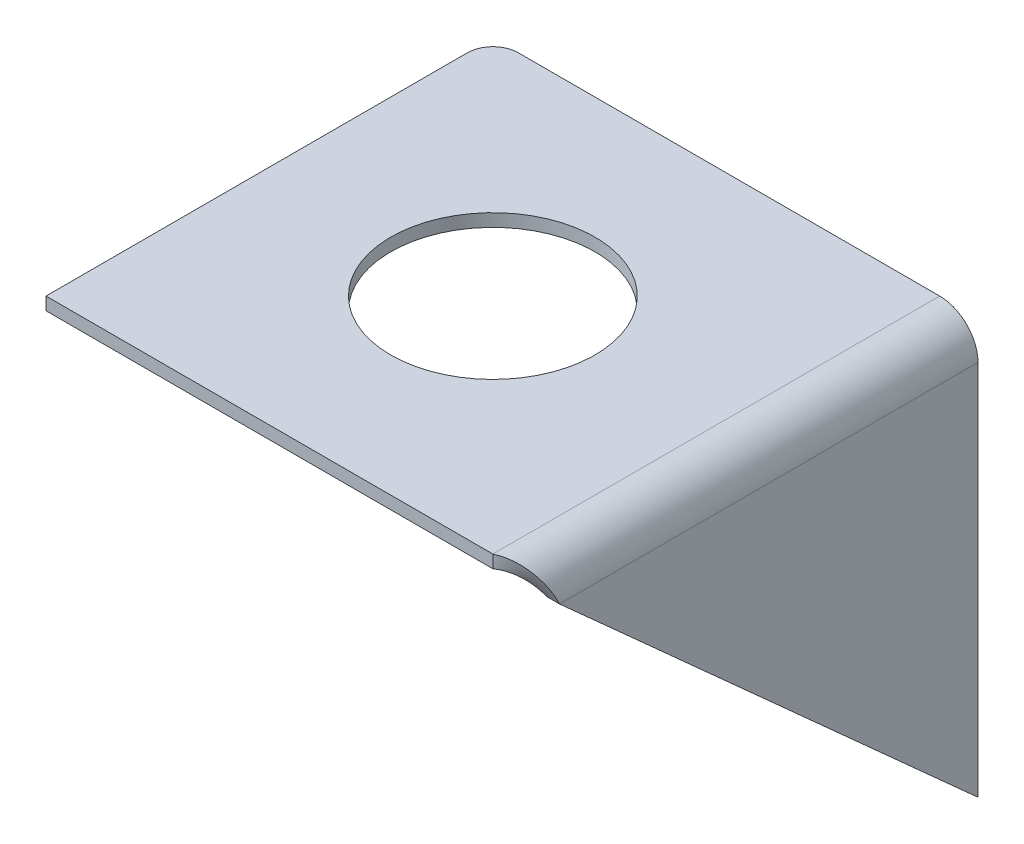
ISO-10303-21;
HEADER;
FILE_DESCRIPTION(('STEP AP214'),'2;1');
FILE_NAME('part.step','',(''),(''),'','','');
FILE_SCHEMA(('AUTOMOTIVE_DESIGN { 1 0 10303 214 1 1 1 1 }'));
ENDSEC;
DATA;
#1=APPLICATION_CONTEXT('core data for automotive mechanical design processes');
#2=APPLICATION_PROTOCOL_DEFINITION('international standard','automotive_design',2000,#1);
#3=PRODUCT_CONTEXT('',#1,'mechanical');
#4=PRODUCT('Part','Part','',(#3));
#5=PRODUCT_RELATED_PRODUCT_CATEGORY('part','',(#4));
#6=PRODUCT_DEFINITION_FORMATION('','',#4);
#7=PRODUCT_DEFINITION_CONTEXT('part definition',#1,'design');
#8=PRODUCT_DEFINITION('design','',#6,#7);
#9=PRODUCT_DEFINITION_SHAPE('','',#8);
#10=(LENGTH_UNIT() NAMED_UNIT(*) SI_UNIT(.MILLI.,.METRE.));
#11=(NAMED_UNIT(*) PLANE_ANGLE_UNIT() SI_UNIT($,.RADIAN.));
#12=(NAMED_UNIT(*) SI_UNIT($,.STERADIAN.) SOLID_ANGLE_UNIT());
#13=UNCERTAINTY_MEASURE_WITH_UNIT(LENGTH_MEASURE(1.E-05),#10,'distance_accuracy_value','');
#14=(GEOMETRIC_REPRESENTATION_CONTEXT(3) GLOBAL_UNCERTAINTY_ASSIGNED_CONTEXT((#13)) GLOBAL_UNIT_ASSIGNED_CONTEXT((#10,
#11,#12)) REPRESENTATION_CONTEXT('',''));
#15=CARTESIAN_POINT('',(0.,0.,0.));
#16=DIRECTION('',(0.,0.,1.));
#17=DIRECTION('',(1.,0.,0.));
#18=AXIS2_PLACEMENT_3D('',#15,#16,#17);
#19=CARTESIAN_POINT('',(-31.,2.,-31.));
#20=DIRECTION('',(0.,1.,0.));
#21=DIRECTION('',(0.,0.,1.));
#22=AXIS2_PLACEMENT_3D('',#19,#20,#21);
#23=CYLINDRICAL_SURFACE('',#22,4.);
#24=DIRECTION('',(0.,1.,0.));
#25=VECTOR('',#24,1.);
#26=CARTESIAN_POINT('',(-31.,2.,-35.));
#27=LINE('',#26,#25);
#28=CARTESIAN_POINT('',(-31.,0.,-35.));
#29=VERTEX_POINT('',#28);
#30=CARTESIAN_POINT('',(-31.,2.,-35.));
#31=VERTEX_POINT('',#30);
#32=EDGE_CURVE('E13',#29,#31,#27,.T.);
#33=ORIENTED_EDGE('',*,*,#32,.F.);
#34=CARTESIAN_POINT('',(-31.,0.,-31.));
#35=DIRECTION('',(0.,1.,0.));
#36=DIRECTION('',(0.,0.,1.));
#37=AXIS2_PLACEMENT_3D('',#34,#35,#36);
#38=CIRCLE('',#37,4.);
#39=CARTESIAN_POINT('',(-35.,0.,-31.));
#40=VERTEX_POINT('',#39);
#41=EDGE_CURVE('E148',#29,#40,#38,.T.);
#42=ORIENTED_EDGE('',*,*,#41,.T.);
#43=DIRECTION('',(0.,1.,0.));
#44=VECTOR('',#43,1.);
#45=CARTESIAN_POINT('',(-35.,2.,-31.));
#46=LINE('',#45,#44);
#47=CARTESIAN_POINT('',(-35.,2.,-31.));
#48=VERTEX_POINT('',#47);
#49=EDGE_CURVE('E64',#40,#48,#46,.T.);
#50=ORIENTED_EDGE('',*,*,#49,.T.);
#51=CARTESIAN_POINT('',(-31.,2.,-31.));
#52=DIRECTION('',(0.,1.,0.));
#53=DIRECTION('',(0.,0.,1.));
#54=AXIS2_PLACEMENT_3D('',#51,#52,#53);
#55=CIRCLE('',#54,4.);
#56=EDGE_CURVE('E125',#31,#48,#55,.T.);
#57=ORIENTED_EDGE('',*,*,#56,.F.);
#58=EDGE_LOOP('',(#33,#42,#50,#57));
#59=FACE_BOUND('',#58,.T.);
#60=ADVANCED_FACE('F54',(#59),#23,.T.);
#61=CARTESIAN_POINT('',(-35.,2.,-31.));
#62=DIRECTION('',(-1.,0.,0.));
#63=DIRECTION('',(0.,0.,1.));
#64=AXIS2_PLACEMENT_3D('',#61,#62,#63);
#65=PLANE('',#64);
#66=ORIENTED_EDGE('',*,*,#49,.F.);
#67=DIRECTION('',(0.,0.,1.));
#68=VECTOR('',#67,1.);
#69=CARTESIAN_POINT('',(-35.,0.,-31.));
#70=LINE('',#69,#68);
#71=CARTESIAN_POINT('',(-35.,0.,35.));
#72=VERTEX_POINT('',#71);
#73=EDGE_CURVE('E146',#40,#72,#70,.T.);
#74=ORIENTED_EDGE('',*,*,#73,.T.);
#75=DIRECTION('',(0.,1.,0.));
#76=VECTOR('',#75,1.);
#77=CARTESIAN_POINT('',(-35.,2.,35.));
#78=LINE('',#77,#76);
#79=CARTESIAN_POINT('',(-35.,2.,35.));
#80=VERTEX_POINT('',#79);
#81=EDGE_CURVE('E72',#72,#80,#78,.T.);
#82=ORIENTED_EDGE('',*,*,#81,.T.);
#83=DIRECTION('',(0.,0.,1.));
#84=VECTOR('',#83,1.);
#85=CARTESIAN_POINT('',(-35.,2.,-31.));
#86=LINE('',#85,#84);
#87=EDGE_CURVE('E128',#48,#80,#86,.T.);
#88=ORIENTED_EDGE('',*,*,#87,.F.);
#89=EDGE_LOOP('',(#66,#74,#82,#88));
#90=FACE_BOUND('',#89,.T.);
#91=ADVANCED_FACE('F173',(#90),#65,.T.);
#92=CARTESIAN_POINT('',(-35.,2.,35.));
#93=DIRECTION('',(0.,0.,1.));
#94=DIRECTION('',(1.,0.,0.));
#95=AXIS2_PLACEMENT_3D('',#92,#93,#94);
#96=PLANE('',#95);
#97=ORIENTED_EDGE('',*,*,#81,.F.);
#98=DIRECTION('',(1.,0.,0.));
#99=VECTOR('',#98,1.);
#100=CARTESIAN_POINT('',(-31.,0.,35.));
#101=LINE('',#100,#99);
#102=CARTESIAN_POINT('',(35.,0.,35.));
#103=VERTEX_POINT('',#102);
#104=EDGE_CURVE('E142',#72,#103,#101,.T.);
#105=ORIENTED_EDGE('',*,*,#104,.T.);
#106=DIRECTION('',(0.,1.,0.));
#107=VECTOR('',#106,1.);
#108=CARTESIAN_POINT('',(35.,2.,35.));
#109=LINE('',#108,#107);
#110=CARTESIAN_POINT('',(35.,2.,35.));
#111=VERTEX_POINT('',#110);
#112=EDGE_CURVE('E153',#103,#111,#109,.T.);
#113=ORIENTED_EDGE('',*,*,#112,.T.);
#114=DIRECTION('',(1.,0.,0.));
#115=VECTOR('',#114,1.);
#116=CARTESIAN_POINT('',(-35.,2.,35.));
#117=LINE('',#116,#115);
#118=EDGE_CURVE('E130',#80,#111,#117,.T.);
#119=ORIENTED_EDGE('',*,*,#118,.F.);
#120=EDGE_LOOP('',(#97,#105,#113,#119));
#121=FACE_BOUND('',#120,.T.);
#122=ADVANCED_FACE('F175',(#121),#96,.T.);
#123=CARTESIAN_POINT('',(-31.,2.,-35.));
#124=DIRECTION('',(0.,0.,-1.));
#125=DIRECTION('',(-1.,0.,0.));
#126=AXIS2_PLACEMENT_3D('',#123,#124,#125);
#127=PLANE('',#126);
#128=DIRECTION('',(1.,0.,0.));
#129=VECTOR('',#128,1.);
#130=CARTESIAN_POINT('',(-31.,0.,-35.));
#131=LINE('',#130,#129);
#132=CARTESIAN_POINT('',(35.,0.,-35.));
#133=VERTEX_POINT('',#132);
#134=EDGE_CURVE('E120',#133,#29,#131,.F.);
#135=ORIENTED_EDGE('',*,*,#134,.T.);
#136=ORIENTED_EDGE('',*,*,#32,.T.);
#137=DIRECTION('',(-1.,0.,0.));
#138=VECTOR('',#137,1.);
#139=CARTESIAN_POINT('',(-31.,2.,-35.));
#140=LINE('',#139,#138);
#141=CARTESIAN_POINT('',(35.,2.,-35.));
#142=VERTEX_POINT('',#141);
#143=EDGE_CURVE('E118',#142,#31,#140,.T.);
#144=ORIENTED_EDGE('',*,*,#143,.F.);
#145=DIRECTION('',(0.,1.,0.));
#146=VECTOR('',#145,1.);
#147=CARTESIAN_POINT('',(35.,2.,-35.));
#148=LINE('',#147,#146);
#149=EDGE_CURVE('E58',#133,#142,#148,.T.);
#150=ORIENTED_EDGE('',*,*,#149,.F.);
#151=EDGE_LOOP('',(#135,#136,#144,#150));
#152=FACE_BOUND('',#151,.T.);
#153=ADVANCED_FACE('F116',(#152),#127,.T.);
#154=CARTESIAN_POINT('',(0.,2.,0.));
#155=DIRECTION('',(0.,1.,0.));
#156=DIRECTION('',(0.,0.,1.));
#157=AXIS2_PLACEMENT_3D('',#154,#155,#156);
#158=CYLINDRICAL_SURFACE('',#157,16.);
#159=CARTESIAN_POINT('',(0.,2.,0.));
#160=DIRECTION('',(0.,1.,0.));
#161=DIRECTION('',(0.,0.,1.));
#162=AXIS2_PLACEMENT_3D('',#159,#160,#161);
#163=CIRCLE('',#162,16.);
#164=CARTESIAN_POINT('',(0.,2.,16.));
#165=VERTEX_POINT('',#164);
#166=EDGE_CURVE('E135',#165,#165,#163,.T.);
#167=ORIENTED_EDGE('',*,*,#166,.T.);
#168=EDGE_LOOP('',(#167));
#169=FACE_BOUND('',#168,.T.);
#170=CARTESIAN_POINT('',(0.,0.,0.));
#171=DIRECTION('',(0.,1.,0.));
#172=DIRECTION('',(0.,0.,1.));
#173=AXIS2_PLACEMENT_3D('',#170,#171,#172);
#174=CIRCLE('',#173,16.);
#175=CARTESIAN_POINT('',(0.,0.,16.));
#176=VERTEX_POINT('',#175);
#177=EDGE_CURVE('E145',#176,#176,#174,.T.);
#178=ORIENTED_EDGE('',*,*,#177,.F.);
#179=EDGE_LOOP('',(#178));
#180=FACE_BOUND('',#179,.T.);
#181=ADVANCED_FACE('F56',(#169,#180),#158,.F.);
#182=CARTESIAN_POINT('',(-31.,2.,-31.));
#183=DIRECTION('',(0.,1.,0.));
#184=DIRECTION('',(0.,0.,1.));
#185=AXIS2_PLACEMENT_3D('',#182,#183,#184);
#186=PLANE('',#185);
#187=DIRECTION('',(0.,0.,-1.));
#188=VECTOR('',#187,1.);
#189=CARTESIAN_POINT('',(35.,2.,-35.));
#190=LINE('',#189,#188);
#191=EDGE_CURVE('E97',#111,#142,#190,.T.);
#192=ORIENTED_EDGE('',*,*,#191,.T.);
#193=ORIENTED_EDGE('',*,*,#143,.T.);
#194=ORIENTED_EDGE('',*,*,#56,.T.);
#195=ORIENTED_EDGE('',*,*,#87,.T.);
#196=ORIENTED_EDGE('',*,*,#118,.T.);
#197=EDGE_LOOP('',(#192,#193,#194,#195,#196));
#198=FACE_BOUND('',#197,.T.);
#199=ORIENTED_EDGE('',*,*,#166,.F.);
#200=EDGE_LOOP('',(#199));
#201=FACE_BOUND('',#200,.T.);
#202=ADVANCED_FACE('F123',(#198,#201),#186,.T.);
#203=CARTESIAN_POINT('',(-31.,0.,-31.));
#204=DIRECTION('',(0.,1.,0.));
#205=DIRECTION('',(0.,0.,1.));
#206=AXIS2_PLACEMENT_3D('',#203,#204,#205);
#207=PLANE('',#206);
#208=DIRECTION('',(0.,0.,1.));
#209=VECTOR('',#208,1.);
#210=CARTESIAN_POINT('',(35.,0.,-31.));
#211=LINE('',#210,#209);
#212=EDGE_CURVE('E138',#103,#133,#211,.F.);
#213=ORIENTED_EDGE('',*,*,#212,.F.);
#214=ORIENTED_EDGE('',*,*,#104,.F.);
#215=ORIENTED_EDGE('',*,*,#73,.F.);
#216=ORIENTED_EDGE('',*,*,#41,.F.);
#217=ORIENTED_EDGE('',*,*,#134,.F.);
#218=EDGE_LOOP('',(#213,#214,#215,#216,#217));
#219=FACE_BOUND('',#218,.T.);
#220=ORIENTED_EDGE('',*,*,#177,.T.);
#221=EDGE_LOOP('',(#220));
#222=FACE_BOUND('',#221,.T.);
#223=ADVANCED_FACE('F170',(#219,#222),#207,.F.);
#224=CARTESIAN_POINT('',(35.,-4.,-35.));
#225=DIRECTION('',(0.,0.,-1.));
#226=DIRECTION('',(-1.,0.,0.));
#227=AXIS2_PLACEMENT_3D('',#224,#225,#226);
#228=PLANE('',#227);
#229=DIRECTION('',(1.,0.,0.));
#230=VECTOR('',#229,1.);
#231=CARTESIAN_POINT('',(41.,-3.99999999999998,-35.));
#232=LINE('',#231,#230);
#233=CARTESIAN_POINT('',(39.,-3.99999999999999,-35.));
#234=VERTEX_POINT('',#233);
#235=CARTESIAN_POINT('',(41.,-3.99999999999998,-35.));
#236=VERTEX_POINT('',#235);
#237=EDGE_CURVE('E286',#234,#236,#232,.T.);
#238=ORIENTED_EDGE('',*,*,#237,.F.);
#239=CARTESIAN_POINT('',(35.,-4.,-35.));
#240=DIRECTION('',(0.,0.,1.));
#241=DIRECTION('',(1.,0.,0.));
#242=AXIS2_PLACEMENT_3D('',#239,#240,#241);
#243=CIRCLE('',#242,4.);
#244=EDGE_CURVE('E167',#133,#234,#243,.F.);
#245=ORIENTED_EDGE('',*,*,#244,.F.);
#246=ORIENTED_EDGE('',*,*,#149,.T.);
#247=CARTESIAN_POINT('',(35.,-4.,-35.));
#248=DIRECTION('',(0.,0.,1.));
#249=DIRECTION('',(1.,0.,0.));
#250=AXIS2_PLACEMENT_3D('',#247,#248,#249);
#251=CIRCLE('',#250,6.);
#252=EDGE_CURVE('E141',#142,#236,#251,.F.);
#253=ORIENTED_EDGE('',*,*,#252,.T.);
#254=EDGE_LOOP('',(#238,#245,#246,#253));
#255=FACE_BOUND('',#254,.T.);
#256=ADVANCED_FACE('F164',(#255),#228,.T.);
#257=CARTESIAN_POINT('',(41.02,-3.99999999999998,30.5555555555556));
#258=CARTESIAN_POINT('',(41.02,-3.21186746954249,30.9259806556928));
#259=CARTESIAN_POINT('',(40.8633155135432,-2.42427773615711,31.2962962962963));
#260=CARTESIAN_POINT('',(40.2601940578926,-0.968213738167171,32.037037037037));
#261=CARTESIAN_POINT('',(39.813994391237,-0.300428745751001,32.4074074074074));
#262=CARTESIAN_POINT('',(38.699571254249,0.813994391237052,33.1481481481482));
#263=CARTESIAN_POINT('',(38.0317862618328,1.26019405789264,33.5185185185185));
#264=CARTESIAN_POINT('',(36.5757222638429,1.86331551354326,34.2592592592593));
#265=CARTESIAN_POINT('',(35.7881325304575,2.02,34.6295748998627));
#266=CARTESIAN_POINT('',(35.,2.02,35.));
#267=CARTESIAN_POINT('',(41.,-3.99999999999998,30.5555555555556));
#268=CARTESIAN_POINT('',(41.,-3.21448599265122,30.9259805544814));
#269=CARTESIAN_POINT('',(40.8438360600099,-2.4295126938443,31.2962962962963));
#270=CARTESIAN_POINT('',(40.2427183301255,-0.978286117774589,32.037037037037));
#271=CARTESIAN_POINT('',(39.7980010543891,-0.312719680150499,32.4074074074074));
#272=CARTESIAN_POINT('',(38.6872803198495,0.798001054389089,33.1481481481482));
#273=CARTESIAN_POINT('',(38.0217138822254,1.24271833012555,33.5185185185185));
#274=CARTESIAN_POINT('',(36.5704873061557,1.8438360600099,34.2592592592593));
#275=CARTESIAN_POINT('',(35.7855140073488,2.,34.6295750010741));
#276=CARTESIAN_POINT('',(35.,2.,35.));
#277=CARTESIAN_POINT('',(39.,-3.99999999999999,30.5555555555556));
#278=CARTESIAN_POINT('',(39.,-3.47633830352483,30.9259704333418));
#279=CARTESIAN_POINT('',(38.8958907066732,-2.95300846256287,31.2962962962963));
#280=CARTESIAN_POINT('',(38.495145553417,-1.98552407851639,32.037037037037));
#281=CARTESIAN_POINT('',(38.1986673695927,-1.54181312010033,32.4074074074074));
#282=CARTESIAN_POINT('',(37.4581868798996,-0.801332630407274,33.1481481481482));
#283=CARTESIAN_POINT('',(37.0144759214836,-0.504854446582964,33.5185185185185));
#284=CARTESIAN_POINT('',(36.0469915374371,-0.104109293326735,34.2592592592593));
#285=CARTESIAN_POINT('',(35.5236616964751,0.,34.6295851222137));
#286=CARTESIAN_POINT('',(35.,0.,35.));
#287=CARTESIAN_POINT('',(38.9798,-3.99999999999999,30.5555555555556));
#288=CARTESIAN_POINT('',(38.9798,-3.47898301186465,30.9259703311183));
#289=CARTESIAN_POINT('',(38.8762164586045,-2.95829576982692,31.2962962962963));
#290=CARTESIAN_POINT('',(38.4774950683723,-1.99569718191989,32.037037037037));
#291=CARTESIAN_POINT('',(38.1825140993763,-1.55422696384383,32.4074074074074));
#292=CARTESIAN_POINT('',(37.4457730361561,-0.817485900623717,33.1481481481482));
#293=CARTESIAN_POINT('',(37.0043028180801,-0.52250493162772,33.5185185185185));
#294=CARTESIAN_POINT('',(36.0417042301731,-0.123783541395435,34.2592592592593));
#295=CARTESIAN_POINT('',(35.5210169881353,-0.0201999999999974,34.6295852244372));
#296=CARTESIAN_POINT('',(35.,-0.0201999999999974,35.));
#297=B_SPLINE_SURFACE_WITH_KNOTS('',1,3,((#257,#258,#259,#260,#261,#262,#263,#264,#265,#266),
(#267,#268,#269,#270,#271,#272,#273,#274,#275,#276),(#277,#278,#279,#280,#281,#282,#283,#284,
#285,#286),(#287,#288,#289,#290,#291,#292,#293,#294,#295,#296)),.UNSPECIFIED.,.F.,.F.,.F.,(2,1,
1,2),(4,2,2,2,4),(-0.01,0.,1.,1.0101),(0.,0.25,0.5,0.75,1.),.UNSPECIFIED.);
#298=CARTESIAN_POINT('',(39.,-3.99999999999999,30.5555555555556));
#299=CARTESIAN_POINT('',(39.0000274755203,-3.86214342866317,30.6530750615278));
#300=CARTESIAN_POINT('',(38.992874570986,-3.7242886595545,30.7505903154907));
#301=CARTESIAN_POINT('',(38.9644046985006,-3.45005606338389,30.9456100857196));
#302=CARTESIAN_POINT('',(38.9430887430913,-3.31367813144852,31.0431146022548));
#303=CARTESIAN_POINT('',(38.8865115317745,-3.04395786422073,31.2380483972806));
#304=CARTESIAN_POINT('',(38.8512611881907,-2.91061323968872,31.3354776750138));
#305=CARTESIAN_POINT('',(38.7672013863381,-2.64827471850216,31.5303385760535));
#306=CARTESIAN_POINT('',(38.7183921698177,-2.51928074432351,31.6277701992873));
#307=CARTESIAN_POINT('',(38.6076288668506,-2.26677839733377,31.822815713552));
#308=CARTESIAN_POINT('',(38.5456504399602,-2.14328070155194,31.9204296056927));
#309=CARTESIAN_POINT('',(38.4092622295631,-1.90334229146896,32.1156520659513));
#310=CARTESIAN_POINT('',(38.3348521768579,-1.78690173005969,32.2132606339081));
#311=CARTESIAN_POINT('',(38.1744367339214,-1.56238242408134,32.408440660869));
#312=CARTESIAN_POINT('',(38.0884363386499,-1.45430010885772,32.5060121178012));
#313=CARTESIAN_POINT('',(37.9057364703864,-1.24759718022382,32.7011555333412));
#314=CARTESIAN_POINT('',(37.8090371753532,-1.14897640948694,32.7987274919136));
#315=CARTESIAN_POINT('',(37.6059540833299,-0.962231722133097,32.9938872123958));
#316=CARTESIAN_POINT('',(37.4995686521825,-0.874109582561006,33.0914749741893));
#317=CARTESIAN_POINT('',(37.2782631000105,-0.709324065577846,33.2866417281228));
#318=CARTESIAN_POINT('',(37.1633431867625,-0.632660409340482,33.3842207204185));
#319=CARTESIAN_POINT('',(36.9261784439221,-0.491598697180235,33.5794070087195));
#320=CARTESIAN_POINT('',(36.8039319079595,-0.427203513291564,33.6770143060082));
#321=CARTESIAN_POINT('',(36.5534515294017,-0.311393285111272,33.8722202754528));
#322=CARTESIAN_POINT('',(36.425218567054,-0.259976339570977,33.9698189467758));
#323=CARTESIAN_POINT('',(36.1906727335881,-0.179739598261492,34.1451694575992));
#324=CARTESIAN_POINT('',(36.0851989834272,-0.148451163569438,34.2229252762404));
#325=CARTESIAN_POINT('',(35.8720410439309,-0.0946672802941426,34.3784250120138));
#326=CARTESIAN_POINT('',(35.7643571751601,-0.0721705658785593,34.4561689292471));
#327=CARTESIAN_POINT('',(35.5476073464045,-0.0361408243190326,34.6115861472515));
#328=CARTESIAN_POINT('',(35.438542774426,-0.0225994267179667,34.6892594460071));
#329=CARTESIAN_POINT('',(35.219652779025,-0.00452288567422105,34.8446214714886));
#330=CARTESIAN_POINT('',(35.1098272287178,1.07176965079861E-05,34.9223101985819));
#331=CARTESIAN_POINT('',(35.,0.,35.));
#332=B_SPLINE_CURVE_WITH_KNOTS('',3,(#298,#299,#300,#301,#302,#303,#304,#305,#306,#307,#308,
#309,#310,#311,#312,#313,#314,#315,#316,#317,#318,#319,#320,#321,#322,#323,#324,#325,#326,#327,
#328,#329,#330,#331),.UNSPECIFIED.,.F.,.F.,(4,2,2,2,2,2,2,2,2,2,2,2,2,2,2,2,4),(0.,
0.506430055601674,1.01282390951047,1.51882197848416,2.02481102632624,2.53174354976965,
3.0386870519169,3.54541277679052,4.05213007436574,4.55893301966657,5.06572363061234,
5.57263273522751,6.07946753697361,6.48333846128448,6.88715121479626,7.29058599254974,
7.69408974003359),.UNSPECIFIED.);
#333=CARTESIAN_POINT('',(39.,-3.99999999999999,30.5555555555556));
#334=VERTEX_POINT('',#333);
#335=EDGE_CURVE('E224',#334,#103,#332,.T.);
#336=DIRECTION('',(1.,0.,0.));
#337=VECTOR('',#336,1.);
#338=CARTESIAN_POINT('',(39.,-3.99999999999999,30.5555555555556));
#339=LINE('',#338,#337);
#340=CARTESIAN_POINT('',(41.,-3.99999999999998,30.5555555555556));
#341=VERTEX_POINT('',#340);
#342=EDGE_CURVE('E267',#334,#341,#339,.T.);
#343=CARTESIAN_POINT('',(41.,-3.99999999999998,30.5555555555556));
#344=CARTESIAN_POINT('',(41.000012298389,-3.84601385164354,30.628173204899));
#345=CARTESIAN_POINT('',(40.9940724970982,-3.69203001353572,30.7007903184267));
#346=CARTESIAN_POINT('',(40.9703798439717,-3.38499642731259,30.8460112725752));
#347=CARTESIAN_POINT('',(40.9526288091943,-3.23194653917132,30.9186151135197));
#348=CARTESIAN_POINT('',(40.9053917003125,-2.92757807762913,31.0638598972499));
#349=CARTESIAN_POINT('',(40.8758991279158,-2.77626051076031,31.1365008382975));
#350=CARTESIAN_POINT('',(40.8053571216489,-2.476331177252,31.281792420299));
#351=CARTESIAN_POINT('',(40.7643062129105,-2.327719758501,31.3544430613074));
#352=CARTESIAN_POINT('',(40.6610301154134,-2.00311936808444,31.5150773357003));
#353=CARTESIAN_POINT('',(40.5961653452189,-1.82796489618491,31.603063991431));
#354=CARTESIAN_POINT('',(40.4503959886972,-1.48444695018406,31.7790451887563));
#355=CARTESIAN_POINT('',(40.3694893857495,-1.31608433309313,31.8670397299506));
#356=CARTESIAN_POINT('',(40.1923609473257,-0.987660972204512,32.0430035692167));
#357=CARTESIAN_POINT('',(40.0961425801227,-0.827598359229803,32.1309728684963));
#358=CARTESIAN_POINT('',(39.8891690013286,-0.517061481989422,32.3069506560805));
#359=CARTESIAN_POINT('',(39.7784072597564,-0.366591570204177,32.3949591441846));
#360=CARTESIAN_POINT('',(39.5433432252374,-0.0766255233235463,32.570985307814));
#361=CARTESIAN_POINT('',(39.4190405475225,0.0628702997471673,32.6590029835293));
#362=CARTESIAN_POINT('',(39.1580332091452,0.329614777940166,32.8349995731283));
#363=CARTESIAN_POINT('',(39.0213339040638,0.456868673304495,32.9229784874058));
#364=CARTESIAN_POINT('',(38.7365950530218,0.698159360944308,33.098982264053));
#365=CARTESIAN_POINT('',(38.5885491731428,0.812188680383107,33.1870071244395));
#366=CARTESIAN_POINT('',(38.2824774048513,1.02595107083808,33.3630507175956));
#367=CARTESIAN_POINT('',(38.1244518064949,1.12568455708104,33.4510694504689));
#368=CARTESIAN_POINT('',(37.7997129630672,1.31003639517566,33.6271601775123));
#369=CARTESIAN_POINT('',(37.6329952592243,1.3946468888905,33.7152321756498));
#370=CARTESIAN_POINT('',(37.2923987572586,1.54795306644251,33.8913739672857));
#371=CARTESIAN_POINT('',(37.1185200888779,1.61664903846969,33.9794437607952));
#372=CARTESIAN_POINT('',(36.765311139589,1.73746277290752,34.1554838871902));
#373=CARTESIAN_POINT('',(36.58598704242,1.78959862225281,34.2434542232952));
#374=CARTESIAN_POINT('',(36.2233280696422,1.87692393642954,34.4193559474763));
#375=CARTESIAN_POINT('',(36.039994983768,1.91212080814429,34.5072873357477));
#376=CARTESIAN_POINT('',(35.7137124612807,1.95912091296372,34.6627366438187));
#377=CARTESIAN_POINT('',(35.5712626560025,1.97445717886081,34.7302572504426));
#378=CARTESIAN_POINT('',(35.2858787498503,1.9948915335284,34.8651834422401));
#379=CARTESIAN_POINT('',(35.1429459097585,2.00000725312245,34.9325890247287));
#380=CARTESIAN_POINT('',(35.,2.,35.));
#381=B_SPLINE_CURVE_WITH_KNOTS('',3,(#343,#344,#345,#346,#347,#348,#349,#350,#351,#352,#353,
#354,#355,#356,#357,#358,#359,#360,#361,#362,#363,#364,#365,#366,#367,#368,#369,#370,#371,#372,
#373,#374,#375,#376,#377,#378,#379,#380),.UNSPECIFIED.,.F.,.F.,(4,2,2,2,2,2,2,2,2,2,2,2,2,2,2,2,
2,2,4),(0.,0.510642603297006,1.0212066667021,1.53205369279472,2.04296593361905,2.66160592528587,
3.28032373561232,3.89890159890498,4.51775815978189,5.13663231016294,5.75524035728443,
6.37419627661806,6.99313421454538,7.61239283294085,8.2316402365417,8.85020895495468,
9.46850694636954,9.94334710275578,10.417367432455),.UNSPECIFIED.);
#382=EDGE_CURVE('E217',#341,#111,#381,.T.);
#383=ORIENTED_EDGE('',*,*,#335,.F.);
#384=ORIENTED_EDGE('',*,*,#342,.T.);
#385=ORIENTED_EDGE('',*,*,#382,.T.);
#386=ORIENTED_EDGE('',*,*,#112,.F.);
#387=EDGE_LOOP('',(#383,#384,#385,#386));
#388=FACE_BOUND('',#387,.T.);
#389=ADVANCED_FACE('F200',(#388),#297,.F.);
#390=CARTESIAN_POINT('',(35.,-4.,35.));
#391=DIRECTION('',(0.,0.,1.));
#392=DIRECTION('',(1.,0.,0.));
#393=AXIS2_PLACEMENT_3D('',#390,#391,#392);
#394=CYLINDRICAL_SURFACE('',#393,6.);
#395=ORIENTED_EDGE('',*,*,#191,.F.);
#396=ORIENTED_EDGE('',*,*,#382,.F.);
#397=DIRECTION('',(0.,0.,1.));
#398=VECTOR('',#397,1.);
#399=CARTESIAN_POINT('',(41.,-3.99999999999998,-35.));
#400=LINE('',#399,#398);
#401=EDGE_CURVE('E258',#341,#236,#400,.F.);
#402=ORIENTED_EDGE('',*,*,#401,.T.);
#403=ORIENTED_EDGE('',*,*,#252,.F.);
#404=EDGE_LOOP('',(#395,#396,#402,#403));
#405=FACE_BOUND('',#404,.T.);
#406=ADVANCED_FACE('F207',(#405),#394,.T.);
#407=CARTESIAN_POINT('',(35.,-4.,35.));
#408=DIRECTION('',(0.,0.,1.));
#409=DIRECTION('',(1.,0.,0.));
#410=AXIS2_PLACEMENT_3D('',#407,#408,#409);
#411=CYLINDRICAL_SURFACE('',#410,4.);
#412=ORIENTED_EDGE('',*,*,#212,.T.);
#413=ORIENTED_EDGE('',*,*,#244,.T.);
#414=DIRECTION('',(0.,0.,1.));
#415=VECTOR('',#414,1.);
#416=CARTESIAN_POINT('',(39.,-3.99999999999999,-35.));
#417=LINE('',#416,#415);
#418=EDGE_CURVE('E284',#234,#334,#417,.T.);
#419=ORIENTED_EDGE('',*,*,#418,.T.);
#420=ORIENTED_EDGE('',*,*,#335,.T.);
#421=EDGE_LOOP('',(#412,#413,#419,#420));
#422=FACE_BOUND('',#421,.T.);
#423=ADVANCED_FACE('F230',(#422),#411,.F.);
#424=CARTESIAN_POINT('',(41.,0.,35.));
#425=DIRECTION('',(0.,-0.743294146247166,0.66896473162245));
#426=DIRECTION('',(0.,-0.66896473162245,-0.743294146247166));
#427=AXIS2_PLACEMENT_3D('',#424,#425,#426);
#428=PLANE('',#427);
#429=DIRECTION('',(0.,-0.66896473162245,-0.743294146247166));
#430=VECTOR('',#429,1.);
#431=CARTESIAN_POINT('',(41.,0.,35.));
#432=LINE('',#431,#430);
#433=CARTESIAN_POINT('',(41.0000000000002,-63.,-35.));
#434=VERTEX_POINT('',#433);
#435=EDGE_CURVE('E261',#434,#341,#432,.F.);
#436=ORIENTED_EDGE('',*,*,#435,.T.);
#437=ORIENTED_EDGE('',*,*,#342,.F.);
#438=DIRECTION('',(0.,0.66896473162245,0.743294146247166));
#439=VECTOR('',#438,1.);
#440=CARTESIAN_POINT('',(39.,-17.403314917127,15.6629834254144));
#441=LINE('',#440,#439);
#442=CARTESIAN_POINT('',(39.0000000000002,-63.,-35.));
#443=VERTEX_POINT('',#442);
#444=EDGE_CURVE('E277',#443,#334,#441,.T.);
#445=ORIENTED_EDGE('',*,*,#444,.F.);
#446=DIRECTION('',(-1.,0.,0.));
#447=VECTOR('',#446,1.);
#448=CARTESIAN_POINT('',(41.0000000000002,-63.,-35.));
#449=LINE('',#448,#447);
#450=EDGE_CURVE('E229',#434,#443,#449,.T.);
#451=ORIENTED_EDGE('',*,*,#450,.F.);
#452=EDGE_LOOP('',(#436,#437,#445,#451));
#453=FACE_BOUND('',#452,.T.);
#454=ADVANCED_FACE('F233',(#453),#428,.T.);
#455=CARTESIAN_POINT('',(41.0000000000002,-63.,-35.));
#456=DIRECTION('',(0.,0.,-1.));
#457=DIRECTION('',(-1.,0.,0.));
#458=AXIS2_PLACEMENT_3D('',#455,#456,#457);
#459=PLANE('',#458);
#460=DIRECTION('',(0.,-1.,0.));
#461=VECTOR('',#460,1.);
#462=CARTESIAN_POINT('',(39.,1.2335811384724E-13,-35.));
#463=LINE('',#462,#461);
#464=EDGE_CURVE('E266',#234,#443,#463,.T.);
#465=ORIENTED_EDGE('',*,*,#464,.F.);
#466=ORIENTED_EDGE('',*,*,#237,.T.);
#467=DIRECTION('',(0.,1.,0.));
#468=VECTOR('',#467,1.);
#469=CARTESIAN_POINT('',(41.0000000000002,-63.,-35.));
#470=LINE('',#469,#468);
#471=EDGE_CURVE('E263',#236,#434,#470,.F.);
#472=ORIENTED_EDGE('',*,*,#471,.T.);
#473=ORIENTED_EDGE('',*,*,#450,.T.);
#474=EDGE_LOOP('',(#465,#466,#472,#473));
#475=FACE_BOUND('',#474,.T.);
#476=ADVANCED_FACE('F238',(#475),#459,.T.);
#477=CARTESIAN_POINT('',(41.,1.30341076524926E-13,0.));
#478=DIRECTION('',(-1.,0.,0.));
#479=DIRECTION('',(0.,-1.,0.));
#480=AXIS2_PLACEMENT_3D('',#477,#478,#479);
#481=PLANE('',#480);
#482=ORIENTED_EDGE('',*,*,#401,.F.);
#483=ORIENTED_EDGE('',*,*,#435,.F.);
#484=ORIENTED_EDGE('',*,*,#471,.F.);
#485=EDGE_LOOP('',(#482,#483,#484));
#486=FACE_BOUND('',#485,.T.);
#487=ADVANCED_FACE('F241',(#486),#481,.F.);
#488=CARTESIAN_POINT('',(39.,1.2335811384724E-13,0.));
#489=DIRECTION('',(-1.,0.,0.));
#490=DIRECTION('',(0.,-1.,0.));
#491=AXIS2_PLACEMENT_3D('',#488,#489,#490);
#492=PLANE('',#491);
#493=ORIENTED_EDGE('',*,*,#444,.T.);
#494=ORIENTED_EDGE('',*,*,#418,.F.);
#495=ORIENTED_EDGE('',*,*,#464,.T.);
#496=EDGE_LOOP('',(#493,#494,#495));
#497=FACE_BOUND('',#496,.T.);
#498=ADVANCED_FACE('F246',(#497),#492,.T.);
#499=CLOSED_SHELL('',(#60,#91,#122,#153,#181,#202,#223,#256,#389,#406,#423,#454,#476,#487,#498));
#500=MANIFOLD_SOLID_BREP('B2',#499);
#501=ADVANCED_BREP_SHAPE_REPRESENTATION('',(#18,#500),#14);
#502=SHAPE_DEFINITION_REPRESENTATION(#9,#501);
ENDSEC;
END-ISO-10303-21;
